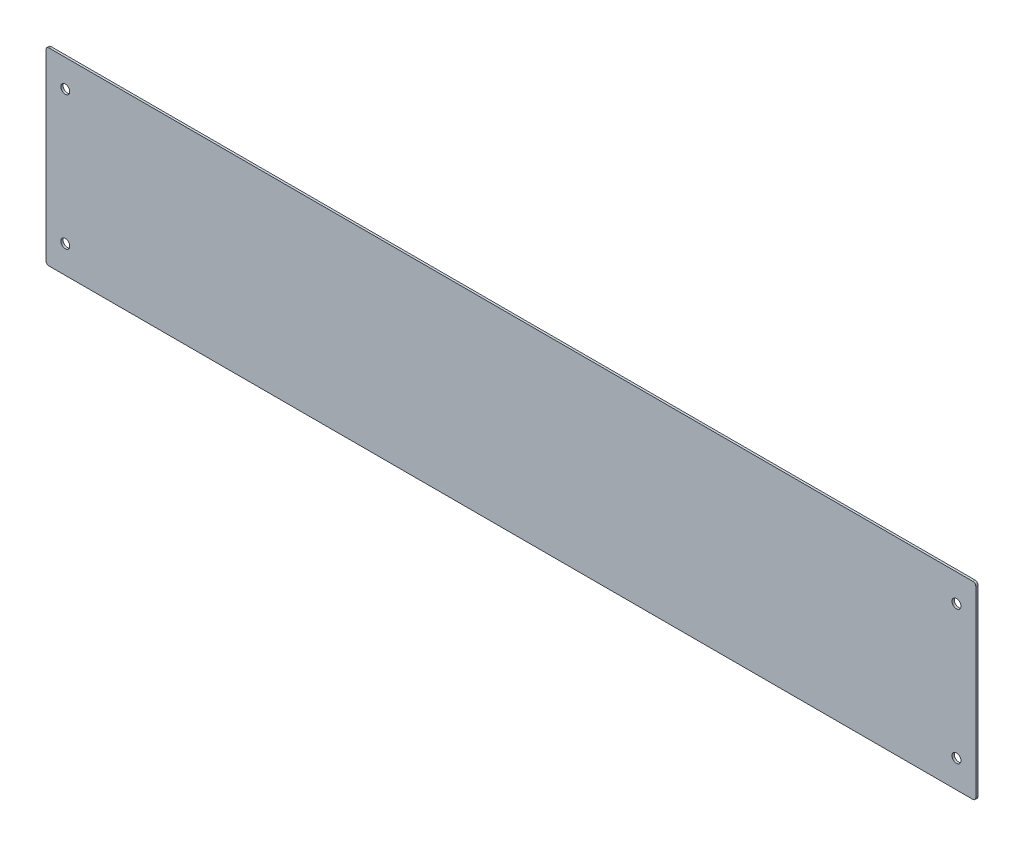
ISO-10303-21;
HEADER;
FILE_DESCRIPTION(('STEP AP214'),'2;1');
FILE_NAME('part.step','',(''),(''),'','','');
FILE_SCHEMA(('AUTOMOTIVE_DESIGN { 1 0 10303 214 1 1 1 1 }'));
ENDSEC;
DATA;
#1=APPLICATION_CONTEXT('core data for automotive mechanical design processes');
#2=APPLICATION_PROTOCOL_DEFINITION('international standard','automotive_design',2000,#1);
#3=PRODUCT_CONTEXT('',#1,'mechanical');
#4=PRODUCT('Part','Part','',(#3));
#5=PRODUCT_RELATED_PRODUCT_CATEGORY('part','',(#4));
#6=PRODUCT_DEFINITION_FORMATION('','',#4);
#7=PRODUCT_DEFINITION_CONTEXT('part definition',#1,'design');
#8=PRODUCT_DEFINITION('design','',#6,#7);
#9=PRODUCT_DEFINITION_SHAPE('','',#8);
#10=(LENGTH_UNIT() NAMED_UNIT(*) SI_UNIT(.MILLI.,.METRE.));
#11=(NAMED_UNIT(*) PLANE_ANGLE_UNIT() SI_UNIT($,.RADIAN.));
#12=(NAMED_UNIT(*) SI_UNIT($,.STERADIAN.) SOLID_ANGLE_UNIT());
#13=UNCERTAINTY_MEASURE_WITH_UNIT(LENGTH_MEASURE(1.E-05),#10,'distance_accuracy_value','');
#14=(GEOMETRIC_REPRESENTATION_CONTEXT(3) GLOBAL_UNCERTAINTY_ASSIGNED_CONTEXT((#13)) GLOBAL_UNIT_ASSIGNED_CONTEXT((#10,
#11,#12)) REPRESENTATION_CONTEXT('',''));
#15=CARTESIAN_POINT('',(0.,0.,0.));
#16=DIRECTION('',(0.,0.,1.));
#17=DIRECTION('',(1.,0.,0.));
#18=AXIS2_PLACEMENT_3D('',#15,#16,#17);
#19=CARTESIAN_POINT('',(0.,0.,1.));
#20=DIRECTION('',(0.,0.,1.));
#21=DIRECTION('',(1.,0.,0.));
#22=AXIS2_PLACEMENT_3D('',#19,#20,#21);
#23=PLANE('',#22);
#24=CARTESIAN_POINT('',(415.7,83.4,1.));
#25=DIRECTION('',(0.,0.,1.));
#26=DIRECTION('',(1.,0.,0.));
#27=AXIS2_PLACEMENT_3D('',#24,#25,#26);
#28=CIRCLE('',#27,1.30000000000002);
#29=CARTESIAN_POINT('',(415.7,84.7,1.));
#30=VERTEX_POINT('',#29);
#31=CARTESIAN_POINT('',(417.,83.4,1.));
#32=VERTEX_POINT('',#31);
#33=EDGE_CURVE('E38',#30,#32,#28,.F.);
#34=ORIENTED_EDGE('',*,*,#33,.F.);
#35=DIRECTION('',(1.,0.,0.));
#36=VECTOR('',#35,1.);
#37=CARTESIAN_POINT('',(415.7,84.7,1.));
#38=LINE('',#37,#36);
#39=CARTESIAN_POINT('',(1.30000000000001,84.7,1.));
#40=VERTEX_POINT('',#39);
#41=EDGE_CURVE('E97',#40,#30,#38,.T.);
#42=ORIENTED_EDGE('',*,*,#41,.F.);
#43=CARTESIAN_POINT('',(1.3,83.4,1.));
#44=DIRECTION('',(0.,0.,1.));
#45=DIRECTION('',(1.,0.,0.));
#46=AXIS2_PLACEMENT_3D('',#43,#44,#45);
#47=CIRCLE('',#46,1.3);
#48=CARTESIAN_POINT('',(0.,83.4,1.));
#49=VERTEX_POINT('',#48);
#50=EDGE_CURVE('E172',#49,#40,#47,.F.);
#51=ORIENTED_EDGE('',*,*,#50,.F.);
#52=DIRECTION('',(0.,1.,0.));
#53=VECTOR('',#52,1.);
#54=CARTESIAN_POINT('',(0.,83.4,1.));
#55=LINE('',#54,#53);
#56=CARTESIAN_POINT('',(0.,1.3,1.));
#57=VERTEX_POINT('',#56);
#58=EDGE_CURVE('E131',#57,#49,#55,.T.);
#59=ORIENTED_EDGE('',*,*,#58,.F.);
#60=CARTESIAN_POINT('',(1.3,1.3,1.));
#61=DIRECTION('',(0.,0.,1.));
#62=DIRECTION('',(1.,0.,0.));
#63=AXIS2_PLACEMENT_3D('',#60,#61,#62);
#64=CIRCLE('',#63,1.3);
#65=CARTESIAN_POINT('',(1.3,0.,1.));
#66=VERTEX_POINT('',#65);
#67=EDGE_CURVE('E171',#66,#57,#64,.F.);
#68=ORIENTED_EDGE('',*,*,#67,.F.);
#69=DIRECTION('',(1.,0.,0.));
#70=VECTOR('',#69,1.);
#71=CARTESIAN_POINT('',(1.3,0.,1.));
#72=LINE('',#71,#70);
#73=CARTESIAN_POINT('',(415.7,0.,1.));
#74=VERTEX_POINT('',#73);
#75=EDGE_CURVE('E127',#74,#66,#72,.F.);
#76=ORIENTED_EDGE('',*,*,#75,.F.);
#77=CARTESIAN_POINT('',(415.7,1.3,1.));
#78=DIRECTION('',(0.,0.,1.));
#79=DIRECTION('',(1.,0.,0.));
#80=AXIS2_PLACEMENT_3D('',#77,#78,#79);
#81=CIRCLE('',#80,1.30000000000002);
#82=CARTESIAN_POINT('',(417.,1.3,1.));
#83=VERTEX_POINT('',#82);
#84=EDGE_CURVE('E114',#83,#74,#81,.F.);
#85=ORIENTED_EDGE('',*,*,#84,.F.);
#86=DIRECTION('',(0.,1.,0.));
#87=VECTOR('',#86,1.);
#88=CARTESIAN_POINT('',(417.,1.3,1.));
#89=LINE('',#88,#87);
#90=EDGE_CURVE('E110',#32,#83,#89,.F.);
#91=ORIENTED_EDGE('',*,*,#90,.F.);
#92=EDGE_LOOP('',(#34,#42,#51,#59,#68,#76,#85,#91));
#93=FACE_BOUND('',#92,.T.);
#94=CARTESIAN_POINT('',(408.349999999999,72.35,1.));
#95=DIRECTION('',(0.,0.,1.));
#96=DIRECTION('',(1.,0.,0.));
#97=AXIS2_PLACEMENT_3D('',#94,#95,#96);
#98=CIRCLE('',#97,2.);
#99=CARTESIAN_POINT('',(410.349999999999,72.35,1.));
#100=VERTEX_POINT('',#99);
#101=EDGE_CURVE('E156',#100,#100,#98,.F.);
#102=ORIENTED_EDGE('',*,*,#101,.T.);
#103=EDGE_LOOP('',(#102));
#104=FACE_BOUND('',#103,.T.);
#105=CARTESIAN_POINT('',(408.349999999999,12.35,1.));
#106=DIRECTION('',(0.,0.,1.));
#107=DIRECTION('',(1.,0.,0.));
#108=AXIS2_PLACEMENT_3D('',#105,#106,#107);
#109=CIRCLE('',#108,2.);
#110=CARTESIAN_POINT('',(410.349999999999,12.35,1.));
#111=VERTEX_POINT('',#110);
#112=EDGE_CURVE('E165',#111,#111,#109,.F.);
#113=ORIENTED_EDGE('',*,*,#112,.T.);
#114=EDGE_LOOP('',(#113));
#115=FACE_BOUND('',#114,.T.);
#116=CARTESIAN_POINT('',(8.64999999999981,72.35,1.));
#117=DIRECTION('',(0.,0.,1.));
#118=DIRECTION('',(1.,0.,0.));
#119=AXIS2_PLACEMENT_3D('',#116,#117,#118);
#120=CIRCLE('',#119,2.);
#121=CARTESIAN_POINT('',(10.6499999999998,72.35,1.));
#122=VERTEX_POINT('',#121);
#123=EDGE_CURVE('E162',#122,#122,#120,.F.);
#124=ORIENTED_EDGE('',*,*,#123,.T.);
#125=EDGE_LOOP('',(#124));
#126=FACE_BOUND('',#125,.T.);
#127=CARTESIAN_POINT('',(8.64999999999981,12.35,1.));
#128=DIRECTION('',(0.,0.,1.));
#129=DIRECTION('',(1.,0.,0.));
#130=AXIS2_PLACEMENT_3D('',#127,#128,#129);
#131=CIRCLE('',#130,2.);
#132=CARTESIAN_POINT('',(10.6499999999998,12.35,1.));
#133=VERTEX_POINT('',#132);
#134=EDGE_CURVE('E159',#133,#133,#131,.F.);
#135=ORIENTED_EDGE('',*,*,#134,.T.);
#136=EDGE_LOOP('',(#135));
#137=FACE_BOUND('',#136,.T.);
#138=ADVANCED_FACE('F35',(#93,#104,#115,#126,#137),#23,.T.);
#139=CARTESIAN_POINT('',(417.,1.3,0.));
#140=DIRECTION('',(1.,0.,0.));
#141=DIRECTION('',(0.,0.,-1.));
#142=AXIS2_PLACEMENT_3D('',#139,#140,#141);
#143=PLANE('',#142);
#144=ORIENTED_EDGE('',*,*,#90,.T.);
#145=DIRECTION('',(0.,0.,1.));
#146=VECTOR('',#145,1.);
#147=CARTESIAN_POINT('',(417.,1.3,0.));
#148=LINE('',#147,#146);
#149=CARTESIAN_POINT('',(417.,1.3,0.));
#150=VERTEX_POINT('',#149);
#151=EDGE_CURVE('E170',#150,#83,#148,.T.);
#152=ORIENTED_EDGE('',*,*,#151,.F.);
#153=DIRECTION('',(0.,1.,0.));
#154=VECTOR('',#153,1.);
#155=CARTESIAN_POINT('',(417.,0.,0.));
#156=LINE('',#155,#154);
#157=CARTESIAN_POINT('',(417.,83.4,0.));
#158=VERTEX_POINT('',#157);
#159=EDGE_CURVE('E121',#150,#158,#156,.T.);
#160=ORIENTED_EDGE('',*,*,#159,.T.);
#161=DIRECTION('',(0.,0.,1.));
#162=VECTOR('',#161,1.);
#163=CARTESIAN_POINT('',(417.,83.4,0.));
#164=LINE('',#163,#162);
#165=EDGE_CURVE('E106',#32,#158,#164,.F.);
#166=ORIENTED_EDGE('',*,*,#165,.F.);
#167=EDGE_LOOP('',(#144,#152,#160,#166));
#168=FACE_BOUND('',#167,.T.);
#169=ADVANCED_FACE('F120',(#168),#143,.T.);
#170=CARTESIAN_POINT('',(415.7,83.4,0.));
#171=DIRECTION('',(0.,0.,1.));
#172=DIRECTION('',(1.,0.,0.));
#173=AXIS2_PLACEMENT_3D('',#170,#171,#172);
#174=CYLINDRICAL_SURFACE('',#173,1.30000000000002);
#175=ORIENTED_EDGE('',*,*,#33,.T.);
#176=ORIENTED_EDGE('',*,*,#165,.T.);
#177=CARTESIAN_POINT('',(415.7,83.4,0.));
#178=DIRECTION('',(0.,0.,1.));
#179=DIRECTION('',(1.,0.,0.));
#180=AXIS2_PLACEMENT_3D('',#177,#178,#179);
#181=CIRCLE('',#180,1.30000000000002);
#182=CARTESIAN_POINT('',(415.7,84.7,0.));
#183=VERTEX_POINT('',#182);
#184=EDGE_CURVE('E154',#158,#183,#181,.T.);
#185=ORIENTED_EDGE('',*,*,#184,.T.);
#186=DIRECTION('',(0.,0.,1.));
#187=VECTOR('',#186,1.);
#188=CARTESIAN_POINT('',(415.7,84.7,0.));
#189=LINE('',#188,#187);
#190=EDGE_CURVE('E108',#30,#183,#189,.F.);
#191=ORIENTED_EDGE('',*,*,#190,.F.);
#192=EDGE_LOOP('',(#175,#176,#185,#191));
#193=FACE_BOUND('',#192,.T.);
#194=ADVANCED_FACE('F103',(#193),#174,.T.);
#195=CARTESIAN_POINT('',(415.7,84.7,0.));
#196=DIRECTION('',(0.,1.,0.));
#197=DIRECTION('',(0.,0.,1.));
#198=AXIS2_PLACEMENT_3D('',#195,#196,#197);
#199=PLANE('',#198);
#200=DIRECTION('',(1.,0.,0.));
#201=VECTOR('',#200,1.);
#202=CARTESIAN_POINT('',(0.,84.7,0.));
#203=LINE('',#202,#201);
#204=CARTESIAN_POINT('',(1.3,84.7,0.));
#205=VERTEX_POINT('',#204);
#206=EDGE_CURVE('E153',#183,#205,#203,.F.);
#207=ORIENTED_EDGE('',*,*,#206,.T.);
#208=DIRECTION('',(0.,0.,1.));
#209=VECTOR('',#208,1.);
#210=CARTESIAN_POINT('',(1.3,84.7,0.));
#211=LINE('',#210,#209);
#212=EDGE_CURVE('E133',#40,#205,#211,.F.);
#213=ORIENTED_EDGE('',*,*,#212,.F.);
#214=ORIENTED_EDGE('',*,*,#41,.T.);
#215=ORIENTED_EDGE('',*,*,#190,.T.);
#216=EDGE_LOOP('',(#207,#213,#214,#215));
#217=FACE_BOUND('',#216,.T.);
#218=ADVANCED_FACE('F178',(#217),#199,.T.);
#219=CARTESIAN_POINT('',(1.3,83.4,0.));
#220=DIRECTION('',(0.,0.,1.));
#221=DIRECTION('',(1.,0.,0.));
#222=AXIS2_PLACEMENT_3D('',#219,#220,#221);
#223=CYLINDRICAL_SURFACE('',#222,1.3);
#224=ORIENTED_EDGE('',*,*,#50,.T.);
#225=ORIENTED_EDGE('',*,*,#212,.T.);
#226=CARTESIAN_POINT('',(1.3,83.4,0.));
#227=DIRECTION('',(0.,0.,1.));
#228=DIRECTION('',(1.,0.,0.));
#229=AXIS2_PLACEMENT_3D('',#226,#227,#228);
#230=CIRCLE('',#229,1.3);
#231=CARTESIAN_POINT('',(0.,83.4,0.));
#232=VERTEX_POINT('',#231);
#233=EDGE_CURVE('E150',#205,#232,#230,.T.);
#234=ORIENTED_EDGE('',*,*,#233,.T.);
#235=DIRECTION('',(0.,0.,1.));
#236=VECTOR('',#235,1.);
#237=CARTESIAN_POINT('',(0.,83.4,0.));
#238=LINE('',#237,#236);
#239=EDGE_CURVE('E132',#49,#232,#238,.F.);
#240=ORIENTED_EDGE('',*,*,#239,.F.);
#241=EDGE_LOOP('',(#224,#225,#234,#240));
#242=FACE_BOUND('',#241,.T.);
#243=ADVANCED_FACE('F200',(#242),#223,.T.);
#244=CARTESIAN_POINT('',(0.,83.4,0.));
#245=DIRECTION('',(-1.,0.,0.));
#246=DIRECTION('',(0.,0.,1.));
#247=AXIS2_PLACEMENT_3D('',#244,#245,#246);
#248=PLANE('',#247);
#249=ORIENTED_EDGE('',*,*,#58,.T.);
#250=ORIENTED_EDGE('',*,*,#239,.T.);
#251=DIRECTION('',(0.,1.,0.));
#252=VECTOR('',#251,1.);
#253=CARTESIAN_POINT('',(0.,0.,0.));
#254=LINE('',#253,#252);
#255=CARTESIAN_POINT('',(0.,1.3,0.));
#256=VERTEX_POINT('',#255);
#257=EDGE_CURVE('E149',#232,#256,#254,.F.);
#258=ORIENTED_EDGE('',*,*,#257,.T.);
#259=DIRECTION('',(0.,0.,1.));
#260=VECTOR('',#259,1.);
#261=CARTESIAN_POINT('',(0.,1.3,0.));
#262=LINE('',#261,#260);
#263=EDGE_CURVE('E129',#57,#256,#262,.F.);
#264=ORIENTED_EDGE('',*,*,#263,.F.);
#265=EDGE_LOOP('',(#249,#250,#258,#264));
#266=FACE_BOUND('',#265,.T.);
#267=ADVANCED_FACE('F196',(#266),#248,.T.);
#268=CARTESIAN_POINT('',(1.3,1.3,0.));
#269=DIRECTION('',(0.,0.,1.));
#270=DIRECTION('',(1.,0.,0.));
#271=AXIS2_PLACEMENT_3D('',#268,#269,#270);
#272=CYLINDRICAL_SURFACE('',#271,1.3);
#273=ORIENTED_EDGE('',*,*,#67,.T.);
#274=ORIENTED_EDGE('',*,*,#263,.T.);
#275=CARTESIAN_POINT('',(1.3,1.3,0.));
#276=DIRECTION('',(0.,0.,1.));
#277=DIRECTION('',(1.,0.,0.));
#278=AXIS2_PLACEMENT_3D('',#275,#276,#277);
#279=CIRCLE('',#278,1.3);
#280=CARTESIAN_POINT('',(1.3,0.,0.));
#281=VERTEX_POINT('',#280);
#282=EDGE_CURVE('E146',#256,#281,#279,.T.);
#283=ORIENTED_EDGE('',*,*,#282,.T.);
#284=DIRECTION('',(0.,0.,-1.));
#285=VECTOR('',#284,1.);
#286=CARTESIAN_POINT('',(1.3,0.,0.));
#287=LINE('',#286,#285);
#288=EDGE_CURVE('E128',#66,#281,#287,.T.);
#289=ORIENTED_EDGE('',*,*,#288,.F.);
#290=EDGE_LOOP('',(#273,#274,#283,#289));
#291=FACE_BOUND('',#290,.T.);
#292=ADVANCED_FACE('F206',(#291),#272,.T.);
#293=CARTESIAN_POINT('',(1.3,0.,0.));
#294=DIRECTION('',(0.,-1.,0.));
#295=DIRECTION('',(0.,0.,-1.));
#296=AXIS2_PLACEMENT_3D('',#293,#294,#295);
#297=PLANE('',#296);
#298=ORIENTED_EDGE('',*,*,#75,.T.);
#299=ORIENTED_EDGE('',*,*,#288,.T.);
#300=DIRECTION('',(1.,0.,0.));
#301=VECTOR('',#300,1.);
#302=CARTESIAN_POINT('',(0.,0.,0.));
#303=LINE('',#302,#301);
#304=CARTESIAN_POINT('',(415.7,0.,0.));
#305=VERTEX_POINT('',#304);
#306=EDGE_CURVE('E53',#281,#305,#303,.T.);
#307=ORIENTED_EDGE('',*,*,#306,.T.);
#308=DIRECTION('',(0.,0.,1.));
#309=VECTOR('',#308,1.);
#310=CARTESIAN_POINT('',(415.7,0.,0.));
#311=LINE('',#310,#309);
#312=EDGE_CURVE('E168',#74,#305,#311,.F.);
#313=ORIENTED_EDGE('',*,*,#312,.F.);
#314=EDGE_LOOP('',(#298,#299,#307,#313));
#315=FACE_BOUND('',#314,.T.);
#316=ADVANCED_FACE('F238',(#315),#297,.T.);
#317=CARTESIAN_POINT('',(415.7,1.3,0.));
#318=DIRECTION('',(0.,0.,1.));
#319=DIRECTION('',(1.,0.,0.));
#320=AXIS2_PLACEMENT_3D('',#317,#318,#319);
#321=CYLINDRICAL_SURFACE('',#320,1.30000000000002);
#322=ORIENTED_EDGE('',*,*,#84,.T.);
#323=ORIENTED_EDGE('',*,*,#312,.T.);
#324=CARTESIAN_POINT('',(415.7,1.3,0.));
#325=DIRECTION('',(0.,0.,1.));
#326=DIRECTION('',(1.,0.,0.));
#327=AXIS2_PLACEMENT_3D('',#324,#325,#326);
#328=CIRCLE('',#327,1.30000000000002);
#329=EDGE_CURVE('E143',#305,#150,#328,.T.);
#330=ORIENTED_EDGE('',*,*,#329,.T.);
#331=ORIENTED_EDGE('',*,*,#151,.T.);
#332=EDGE_LOOP('',(#322,#323,#330,#331));
#333=FACE_BOUND('',#332,.T.);
#334=ADVANCED_FACE('F234',(#333),#321,.T.);
#335=CARTESIAN_POINT('',(408.349999999999,12.35,0.));
#336=DIRECTION('',(0.,0.,1.));
#337=DIRECTION('',(1.,0.,0.));
#338=AXIS2_PLACEMENT_3D('',#335,#336,#337);
#339=CYLINDRICAL_SURFACE('',#338,2.);
#340=CARTESIAN_POINT('',(408.349999999999,12.35,0.));
#341=DIRECTION('',(0.,0.,1.));
#342=DIRECTION('',(1.,0.,0.));
#343=AXIS2_PLACEMENT_3D('',#340,#341,#342);
#344=CIRCLE('',#343,2.);
#345=CARTESIAN_POINT('',(410.349999999999,12.35,0.));
#346=VERTEX_POINT('',#345);
#347=EDGE_CURVE('E140',#346,#346,#344,.F.);
#348=ORIENTED_EDGE('',*,*,#347,.T.);
#349=EDGE_LOOP('',(#348));
#350=FACE_BOUND('',#349,.T.);
#351=ORIENTED_EDGE('',*,*,#112,.F.);
#352=EDGE_LOOP('',(#351));
#353=FACE_BOUND('',#352,.T.);
#354=ADVANCED_FACE('F230',(#350,#353),#339,.F.);
#355=CARTESIAN_POINT('',(8.64999999999981,72.35,0.));
#356=DIRECTION('',(0.,0.,1.));
#357=DIRECTION('',(1.,0.,0.));
#358=AXIS2_PLACEMENT_3D('',#355,#356,#357);
#359=CYLINDRICAL_SURFACE('',#358,2.);
#360=CARTESIAN_POINT('',(8.64999999999981,72.35,0.));
#361=DIRECTION('',(0.,0.,1.));
#362=DIRECTION('',(1.,0.,0.));
#363=AXIS2_PLACEMENT_3D('',#360,#361,#362);
#364=CIRCLE('',#363,2.);
#365=CARTESIAN_POINT('',(10.6499999999998,72.35,0.));
#366=VERTEX_POINT('',#365);
#367=EDGE_CURVE('E137',#366,#366,#364,.F.);
#368=ORIENTED_EDGE('',*,*,#367,.T.);
#369=EDGE_LOOP('',(#368));
#370=FACE_BOUND('',#369,.T.);
#371=ORIENTED_EDGE('',*,*,#123,.F.);
#372=EDGE_LOOP('',(#371));
#373=FACE_BOUND('',#372,.T.);
#374=ADVANCED_FACE('F226',(#370,#373),#359,.F.);
#375=CARTESIAN_POINT('',(8.64999999999981,12.35,0.));
#376=DIRECTION('',(0.,0.,1.));
#377=DIRECTION('',(1.,0.,0.));
#378=AXIS2_PLACEMENT_3D('',#375,#376,#377);
#379=CYLINDRICAL_SURFACE('',#378,2.);
#380=CARTESIAN_POINT('',(8.64999999999981,12.35,0.));
#381=DIRECTION('',(0.,0.,1.));
#382=DIRECTION('',(1.,0.,0.));
#383=AXIS2_PLACEMENT_3D('',#380,#381,#382);
#384=CIRCLE('',#383,2.);
#385=CARTESIAN_POINT('',(10.6499999999998,12.35,0.));
#386=VERTEX_POINT('',#385);
#387=EDGE_CURVE('E44',#386,#386,#384,.F.);
#388=ORIENTED_EDGE('',*,*,#387,.T.);
#389=EDGE_LOOP('',(#388));
#390=FACE_BOUND('',#389,.T.);
#391=ORIENTED_EDGE('',*,*,#134,.F.);
#392=EDGE_LOOP('',(#391));
#393=FACE_BOUND('',#392,.T.);
#394=ADVANCED_FACE('F218',(#390,#393),#379,.F.);
#395=CARTESIAN_POINT('',(408.349999999999,72.35,0.));
#396=DIRECTION('',(0.,0.,1.));
#397=DIRECTION('',(1.,0.,0.));
#398=AXIS2_PLACEMENT_3D('',#395,#396,#397);
#399=CYLINDRICAL_SURFACE('',#398,2.);
#400=CARTESIAN_POINT('',(408.349999999999,72.35,0.));
#401=DIRECTION('',(0.,0.,1.));
#402=DIRECTION('',(1.,0.,0.));
#403=AXIS2_PLACEMENT_3D('',#400,#401,#402);
#404=CIRCLE('',#403,2.);
#405=CARTESIAN_POINT('',(410.349999999999,72.35,0.));
#406=VERTEX_POINT('',#405);
#407=EDGE_CURVE('E11',#406,#406,#404,.F.);
#408=ORIENTED_EDGE('',*,*,#407,.T.);
#409=EDGE_LOOP('',(#408));
#410=FACE_BOUND('',#409,.T.);
#411=ORIENTED_EDGE('',*,*,#101,.F.);
#412=EDGE_LOOP('',(#411));
#413=FACE_BOUND('',#412,.T.);
#414=ADVANCED_FACE('F211',(#410,#413),#399,.F.);
#415=CARTESIAN_POINT('',(0.,0.,0.));
#416=DIRECTION('',(0.,0.,1.));
#417=DIRECTION('',(1.,0.,0.));
#418=AXIS2_PLACEMENT_3D('',#415,#416,#417);
#419=PLANE('',#418);
#420=ORIENTED_EDGE('',*,*,#407,.F.);
#421=EDGE_LOOP('',(#420));
#422=FACE_BOUND('',#421,.T.);
#423=ORIENTED_EDGE('',*,*,#347,.F.);
#424=EDGE_LOOP('',(#423));
#425=FACE_BOUND('',#424,.T.);
#426=ORIENTED_EDGE('',*,*,#329,.F.);
#427=ORIENTED_EDGE('',*,*,#306,.F.);
#428=ORIENTED_EDGE('',*,*,#282,.F.);
#429=ORIENTED_EDGE('',*,*,#257,.F.);
#430=ORIENTED_EDGE('',*,*,#233,.F.);
#431=ORIENTED_EDGE('',*,*,#206,.F.);
#432=ORIENTED_EDGE('',*,*,#184,.F.);
#433=ORIENTED_EDGE('',*,*,#159,.F.);
#434=EDGE_LOOP('',(#426,#427,#428,#429,#430,#431,#432,#433));
#435=FACE_BOUND('',#434,.T.);
#436=ORIENTED_EDGE('',*,*,#367,.F.);
#437=EDGE_LOOP('',(#436));
#438=FACE_BOUND('',#437,.T.);
#439=ORIENTED_EDGE('',*,*,#387,.F.);
#440=EDGE_LOOP('',(#439));
#441=FACE_BOUND('',#440,.T.);
#442=ADVANCED_FACE('F182',(#422,#425,#435,#438,#441),#419,.F.);
#443=CLOSED_SHELL('',(#138,#169,#194,#218,#243,#267,#292,#316,#334,#354,#374,#394,#414,#442));
#444=MANIFOLD_SOLID_BREP('B2',#443);
#445=ADVANCED_BREP_SHAPE_REPRESENTATION('',(#18,#444),#14);
#446=SHAPE_DEFINITION_REPRESENTATION(#9,#445);
ENDSEC;
END-ISO-10303-21;
